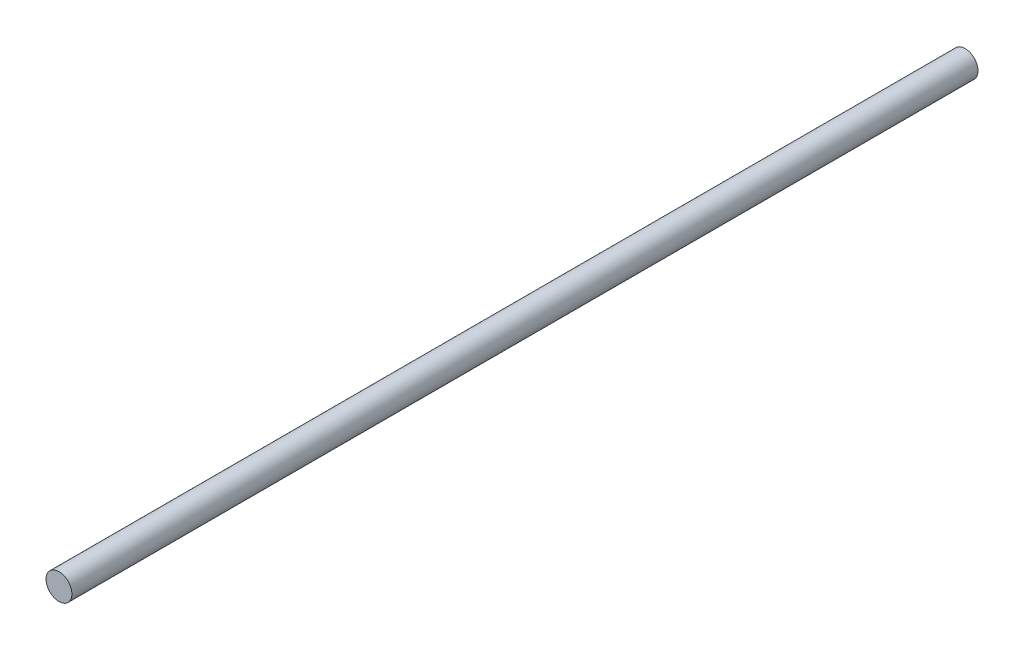
ISO-10303-21;
HEADER;
FILE_DESCRIPTION(('STEP AP214'),'2;1');
FILE_NAME('part.step','',(''),(''),'','','');
FILE_SCHEMA(('AUTOMOTIVE_DESIGN { 1 0 10303 214 1 1 1 1 }'));
ENDSEC;
DATA;
#1=APPLICATION_CONTEXT('core data for automotive mechanical design processes');
#2=APPLICATION_PROTOCOL_DEFINITION('international standard','automotive_design',2000,#1);
#3=PRODUCT_CONTEXT('',#1,'mechanical');
#4=PRODUCT('Part','Part','',(#3));
#5=PRODUCT_RELATED_PRODUCT_CATEGORY('part','',(#4));
#6=PRODUCT_DEFINITION_FORMATION('','',#4);
#7=PRODUCT_DEFINITION_CONTEXT('part definition',#1,'design');
#8=PRODUCT_DEFINITION('design','',#6,#7);
#9=PRODUCT_DEFINITION_SHAPE('','',#8);
#10=(LENGTH_UNIT() NAMED_UNIT(*) SI_UNIT(.MILLI.,.METRE.));
#11=(NAMED_UNIT(*) PLANE_ANGLE_UNIT() SI_UNIT($,.RADIAN.));
#12=(NAMED_UNIT(*) SI_UNIT($,.STERADIAN.) SOLID_ANGLE_UNIT());
#13=UNCERTAINTY_MEASURE_WITH_UNIT(LENGTH_MEASURE(1.E-05),#10,'distance_accuracy_value','');
#14=(GEOMETRIC_REPRESENTATION_CONTEXT(3) GLOBAL_UNCERTAINTY_ASSIGNED_CONTEXT((#13)) GLOBAL_UNIT_ASSIGNED_CONTEXT((#10,
#11,#12)) REPRESENTATION_CONTEXT('',''));
#15=CARTESIAN_POINT('',(0.,0.,0.));
#16=DIRECTION('',(0.,0.,1.));
#17=DIRECTION('',(1.,0.,0.));
#18=AXIS2_PLACEMENT_3D('',#15,#16,#17);
#19=CARTESIAN_POINT('',(0.,0.,105.));
#20=DIRECTION('',(0.,0.,-1.));
#21=DIRECTION('',(-1.,0.,0.));
#22=AXIS2_PLACEMENT_3D('',#19,#20,#21);
#23=CYLINDRICAL_SURFACE('',#22,1.5);
#24=CARTESIAN_POINT('',(0.,0.,105.));
#25=DIRECTION('',(0.,0.,-1.));
#26=DIRECTION('',(-1.,0.,0.));
#27=AXIS2_PLACEMENT_3D('',#24,#25,#26);
#28=CIRCLE('',#27,1.5);
#29=CARTESIAN_POINT('',(-1.5,0.,105.));
#30=VERTEX_POINT('',#29);
#31=EDGE_CURVE('E10',#30,#30,#28,.T.);
#32=ORIENTED_EDGE('',*,*,#31,.T.);
#33=EDGE_LOOP('',(#32));
#34=FACE_BOUND('',#33,.T.);
#35=CARTESIAN_POINT('',(0.,0.,0.));
#36=DIRECTION('',(0.,0.,-1.));
#37=DIRECTION('',(-1.,0.,0.));
#38=AXIS2_PLACEMENT_3D('',#35,#36,#37);
#39=CIRCLE('',#38,1.5);
#40=CARTESIAN_POINT('',(-1.5,0.,0.));
#41=VERTEX_POINT('',#40);
#42=EDGE_CURVE('E40',#41,#41,#39,.T.);
#43=ORIENTED_EDGE('',*,*,#42,.F.);
#44=EDGE_LOOP('',(#43));
#45=FACE_BOUND('',#44,.T.);
#46=ADVANCED_FACE('F34',(#34,#45),#23,.T.);
#47=CARTESIAN_POINT('',(1.5,0.,105.));
#48=DIRECTION('',(0.,0.,1.));
#49=DIRECTION('',(1.,0.,0.));
#50=AXIS2_PLACEMENT_3D('',#47,#48,#49);
#51=PLANE('',#50);
#52=ORIENTED_EDGE('',*,*,#31,.F.);
#53=EDGE_LOOP('',(#52));
#54=FACE_BOUND('',#53,.T.);
#55=ADVANCED_FACE('F49',(#54),#51,.T.);
#56=CARTESIAN_POINT('',(0.,0.,0.));
#57=DIRECTION('',(0.,0.,-1.));
#58=DIRECTION('',(-1.,0.,0.));
#59=AXIS2_PLACEMENT_3D('',#56,#57,#58);
#60=PLANE('',#59);
#61=ORIENTED_EDGE('',*,*,#42,.T.);
#62=EDGE_LOOP('',(#61));
#63=FACE_BOUND('',#62,.T.);
#64=ADVANCED_FACE('F46',(#63),#60,.T.);
#65=CLOSED_SHELL('',(#46,#55,#64));
#66=MANIFOLD_SOLID_BREP('B2',#65);
#67=ADVANCED_BREP_SHAPE_REPRESENTATION('',(#18,#66),#14);
#68=SHAPE_DEFINITION_REPRESENTATION(#9,#67);
ENDSEC;
END-ISO-10303-21;
